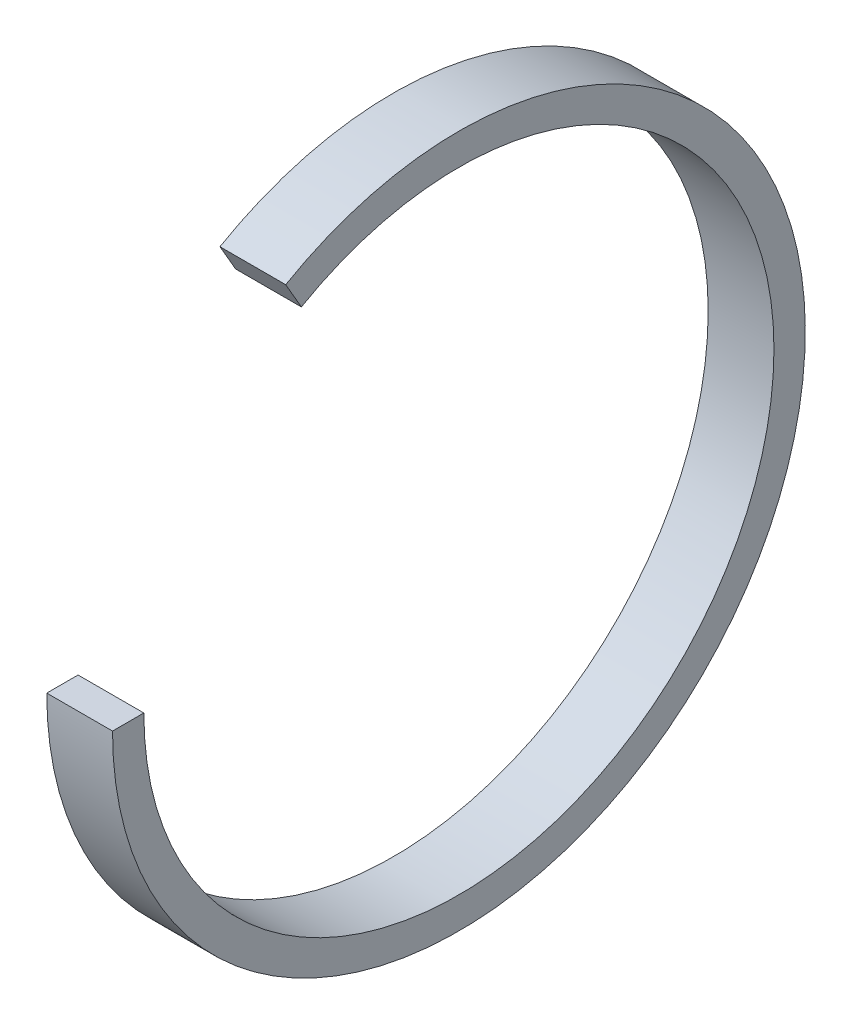
ISO-10303-21;
HEADER;
FILE_DESCRIPTION(('STEP AP214'),'2;1');
FILE_NAME('part.step','',(''),(''),'','','');
FILE_SCHEMA(('AUTOMOTIVE_DESIGN { 1 0 10303 214 1 1 1 1 }'));
ENDSEC;
DATA;
#1=APPLICATION_CONTEXT('core data for automotive mechanical design processes');
#2=APPLICATION_PROTOCOL_DEFINITION('international standard','automotive_design',2000,#1);
#3=PRODUCT_CONTEXT('',#1,'mechanical');
#4=PRODUCT('Part','Part','',(#3));
#5=PRODUCT_RELATED_PRODUCT_CATEGORY('part','',(#4));
#6=PRODUCT_DEFINITION_FORMATION('','',#4);
#7=PRODUCT_DEFINITION_CONTEXT('part definition',#1,'design');
#8=PRODUCT_DEFINITION('design','',#6,#7);
#9=PRODUCT_DEFINITION_SHAPE('','',#8);
#10=(LENGTH_UNIT() NAMED_UNIT(*) SI_UNIT(.MILLI.,.METRE.));
#11=(NAMED_UNIT(*) PLANE_ANGLE_UNIT() SI_UNIT($,.RADIAN.));
#12=(NAMED_UNIT(*) SI_UNIT($,.STERADIAN.) SOLID_ANGLE_UNIT());
#13=UNCERTAINTY_MEASURE_WITH_UNIT(LENGTH_MEASURE(1.E-05),#10,'distance_accuracy_value','');
#14=(GEOMETRIC_REPRESENTATION_CONTEXT(3) GLOBAL_UNCERTAINTY_ASSIGNED_CONTEXT((#13)) GLOBAL_UNIT_ASSIGNED_CONTEXT((#10,
#11,#12)) REPRESENTATION_CONTEXT('',''));
#15=CARTESIAN_POINT('',(0.,0.,0.));
#16=DIRECTION('',(0.,0.,1.));
#17=DIRECTION('',(1.,0.,0.));
#18=AXIS2_PLACEMENT_3D('',#15,#16,#17);
#19=CARTESIAN_POINT('',(0.,0.,55.3));
#20=DIRECTION('',(-1.,0.,0.));
#21=DIRECTION('',(0.,0.,1.));
#22=AXIS2_PLACEMENT_3D('',#19,#20,#21);
#23=PLANE('',#22);
#24=CARTESIAN_POINT('',(0.,0.,0.));
#25=DIRECTION('',(1.,0.,0.));
#26=DIRECTION('',(0.,0.,-1.));
#27=AXIS2_PLACEMENT_3D('',#24,#25,#26);
#28=CIRCLE('',#27,50.3);
#29=CARTESIAN_POINT('',(0.,0.,50.3));
#30=VERTEX_POINT('',#29);
#31=CARTESIAN_POINT('',(0.,43.5610778103572,25.15));
#32=VERTEX_POINT('',#31);
#33=EDGE_CURVE('E10',#30,#32,#28,.T.);
#34=ORIENTED_EDGE('',*,*,#33,.T.);
#35=DIRECTION('',(0.,-0.866025403784439,-0.5));
#36=VECTOR('',#35,1.);
#37=CARTESIAN_POINT('',(0.,47.8912048292795,27.65));
#38=LINE('',#37,#36);
#39=CARTESIAN_POINT('',(0.,47.8912048292795,27.65));
#40=VERTEX_POINT('',#39);
#41=EDGE_CURVE('E25',#40,#32,#38,.T.);
#42=ORIENTED_EDGE('',*,*,#41,.F.);
#43=CARTESIAN_POINT('',(0.,0.,0.));
#44=DIRECTION('',(1.,0.,0.));
#45=DIRECTION('',(0.,0.,-1.));
#46=AXIS2_PLACEMENT_3D('',#43,#44,#45);
#47=CIRCLE('',#46,55.3);
#48=CARTESIAN_POINT('',(0.,0.,55.3));
#49=VERTEX_POINT('',#48);
#50=EDGE_CURVE('E75',#49,#40,#47,.T.);
#51=ORIENTED_EDGE('',*,*,#50,.F.);
#52=DIRECTION('',(0.,0.,-1.));
#53=VECTOR('',#52,1.);
#54=CARTESIAN_POINT('',(0.,0.,55.3));
#55=LINE('',#54,#53);
#56=EDGE_CURVE('E109',#49,#30,#55,.T.);
#57=ORIENTED_EDGE('',*,*,#56,.T.);
#58=EDGE_LOOP('',(#34,#42,#51,#57));
#59=FACE_BOUND('',#58,.T.);
#60=ADVANCED_FACE('F16',(#59),#23,.T.);
#61=CARTESIAN_POINT('',(0.,0.,0.));
#62=DIRECTION('',(0.,-1.,0.));
#63=DIRECTION('',(0.,0.,-1.));
#64=AXIS2_PLACEMENT_3D('',#61,#62,#63);
#65=PLANE('',#64);
#66=ORIENTED_EDGE('',*,*,#56,.F.);
#67=DIRECTION('',(-1.,0.,0.));
#68=VECTOR('',#67,1.);
#69=CARTESIAN_POINT('',(10.5,0.,55.3));
#70=LINE('',#69,#68);
#71=CARTESIAN_POINT('',(10.5,0.,55.3));
#72=VERTEX_POINT('',#71);
#73=EDGE_CURVE('E104',#72,#49,#70,.T.);
#74=ORIENTED_EDGE('',*,*,#73,.F.);
#75=DIRECTION('',(0.,0.,1.));
#76=VECTOR('',#75,1.);
#77=CARTESIAN_POINT('',(10.5,0.,50.3));
#78=LINE('',#77,#76);
#79=CARTESIAN_POINT('',(10.5,0.,50.3));
#80=VERTEX_POINT('',#79);
#81=EDGE_CURVE('E69',#80,#72,#78,.T.);
#82=ORIENTED_EDGE('',*,*,#81,.F.);
#83=DIRECTION('',(1.,0.,0.));
#84=VECTOR('',#83,1.);
#85=CARTESIAN_POINT('',(0.,0.,50.3));
#86=LINE('',#85,#84);
#87=EDGE_CURVE('E94',#30,#80,#86,.T.);
#88=ORIENTED_EDGE('',*,*,#87,.F.);
#89=EDGE_LOOP('',(#66,#74,#82,#88));
#90=FACE_BOUND('',#89,.T.);
#91=ADVANCED_FACE('F138',(#90),#65,.F.);
#92=CARTESIAN_POINT('',(50.,0.,0.));
#93=DIRECTION('',(1.,0.,0.));
#94=DIRECTION('',(0.,0.499999995060112,0.866025406636485));
#95=AXIS2_PLACEMENT_3D('',#92,#93,#94);
#96=CYLINDRICAL_SURFACE('',#95,50.3);
#97=CARTESIAN_POINT('',(10.5,0.,0.));
#98=DIRECTION('',(1.,0.,0.));
#99=DIRECTION('',(0.,0.,-1.));
#100=AXIS2_PLACEMENT_3D('',#97,#98,#99);
#101=CIRCLE('',#100,50.3);
#102=CARTESIAN_POINT('',(10.5,43.5610778103572,25.15));
#103=VERTEX_POINT('',#102);
#104=EDGE_CURVE('E89',#80,#103,#101,.T.);
#105=ORIENTED_EDGE('',*,*,#104,.T.);
#106=DIRECTION('',(1.,0.,0.));
#107=VECTOR('',#106,1.);
#108=CARTESIAN_POINT('',(0.,43.5610778103572,25.15));
#109=LINE('',#108,#107);
#110=EDGE_CURVE('E60',#32,#103,#109,.T.);
#111=ORIENTED_EDGE('',*,*,#110,.F.);
#112=ORIENTED_EDGE('',*,*,#33,.F.);
#113=ORIENTED_EDGE('',*,*,#87,.T.);
#114=EDGE_LOOP('',(#105,#111,#112,#113));
#115=FACE_BOUND('',#114,.T.);
#116=ADVANCED_FACE('F140',(#115),#96,.F.);
#117=CARTESIAN_POINT('',(0.,0.,0.));
#118=DIRECTION('',(0.,-0.5,0.866025403784439));
#119=DIRECTION('',(0.,-0.866025403784439,-0.5));
#120=AXIS2_PLACEMENT_3D('',#117,#118,#119);
#121=PLANE('',#120);
#122=ORIENTED_EDGE('',*,*,#41,.T.);
#123=ORIENTED_EDGE('',*,*,#110,.T.);
#124=DIRECTION('',(0.,0.866025403784439,0.5));
#125=VECTOR('',#124,1.);
#126=CARTESIAN_POINT('',(10.5,43.5610778103572,25.15));
#127=LINE('',#126,#125);
#128=CARTESIAN_POINT('',(10.5,47.8912048292795,27.65));
#129=VERTEX_POINT('',#128);
#130=EDGE_CURVE('E54',#103,#129,#127,.T.);
#131=ORIENTED_EDGE('',*,*,#130,.T.);
#132=DIRECTION('',(-1.,0.,0.));
#133=VECTOR('',#132,1.);
#134=CARTESIAN_POINT('',(10.5,47.8912048292795,27.65));
#135=LINE('',#134,#133);
#136=EDGE_CURVE('E58',#129,#40,#135,.T.);
#137=ORIENTED_EDGE('',*,*,#136,.T.);
#138=EDGE_LOOP('',(#122,#123,#131,#137));
#139=FACE_BOUND('',#138,.T.);
#140=ADVANCED_FACE('F56',(#139),#121,.T.);
#141=CARTESIAN_POINT('',(50.,0.,0.));
#142=DIRECTION('',(1.,0.,0.));
#143=DIRECTION('',(0.,0.499999995060111,0.866025406636485));
#144=AXIS2_PLACEMENT_3D('',#141,#142,#143);
#145=CYLINDRICAL_SURFACE('',#144,55.3);
#146=ORIENTED_EDGE('',*,*,#73,.T.);
#147=ORIENTED_EDGE('',*,*,#50,.T.);
#148=ORIENTED_EDGE('',*,*,#136,.F.);
#149=CARTESIAN_POINT('',(10.5,0.,0.));
#150=DIRECTION('',(1.,0.,0.));
#151=DIRECTION('',(0.,0.,-1.));
#152=AXIS2_PLACEMENT_3D('',#149,#150,#151);
#153=CIRCLE('',#152,55.3);
#154=EDGE_CURVE('E67',#72,#129,#153,.T.);
#155=ORIENTED_EDGE('',*,*,#154,.F.);
#156=EDGE_LOOP('',(#146,#147,#148,#155));
#157=FACE_BOUND('',#156,.T.);
#158=ADVANCED_FACE('F74',(#157),#145,.T.);
#159=CARTESIAN_POINT('',(10.5,0.,50.3));
#160=DIRECTION('',(1.,0.,0.));
#161=DIRECTION('',(0.,0.,-1.));
#162=AXIS2_PLACEMENT_3D('',#159,#160,#161);
#163=PLANE('',#162);
#164=ORIENTED_EDGE('',*,*,#154,.T.);
#165=ORIENTED_EDGE('',*,*,#130,.F.);
#166=ORIENTED_EDGE('',*,*,#104,.F.);
#167=ORIENTED_EDGE('',*,*,#81,.T.);
#168=EDGE_LOOP('',(#164,#165,#166,#167));
#169=FACE_BOUND('',#168,.T.);
#170=ADVANCED_FACE('F68',(#169),#163,.T.);
#171=CLOSED_SHELL('',(#60,#91,#116,#140,#158,#170));
#172=MANIFOLD_SOLID_BREP('B1',#171);
#173=ADVANCED_BREP_SHAPE_REPRESENTATION('',(#18,#172),#14);
#174=SHAPE_DEFINITION_REPRESENTATION(#9,#173);
ENDSEC;
END-ISO-10303-21;
